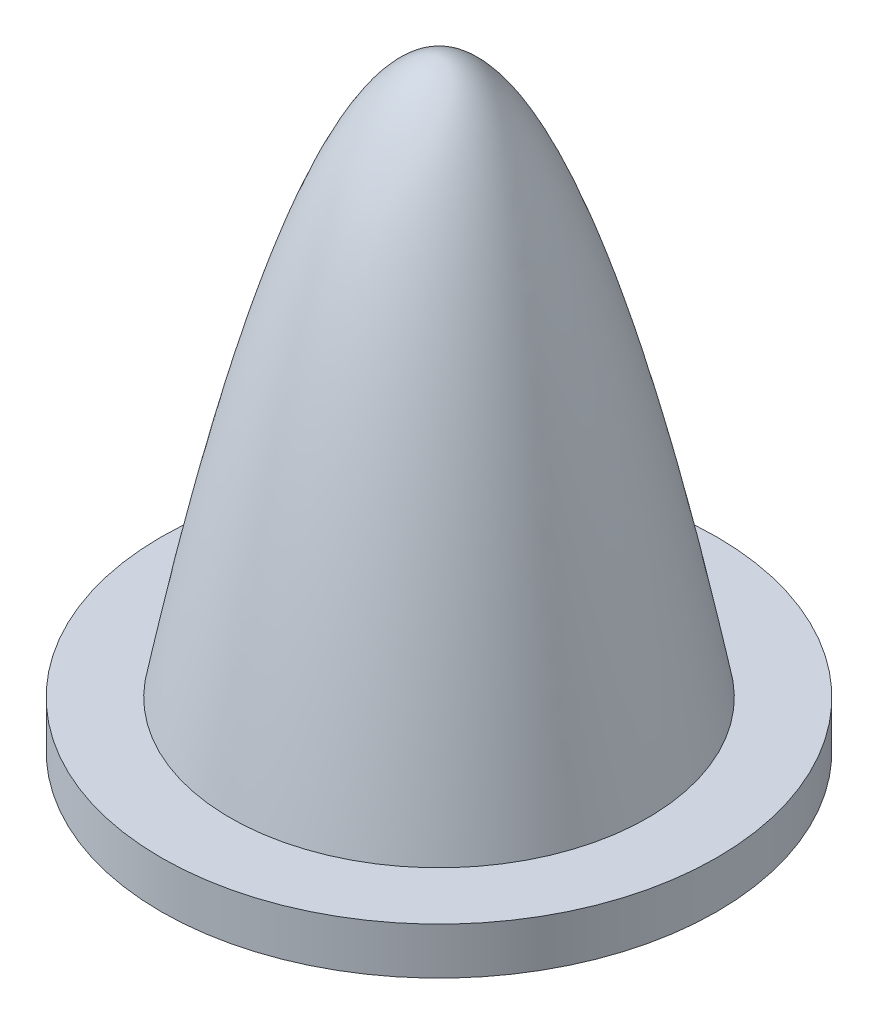
ISO-10303-21;
HEADER;
FILE_DESCRIPTION(('STEP AP214'),'2;1');
FILE_NAME('part.step','',(''),(''),'','','');
FILE_SCHEMA(('AUTOMOTIVE_DESIGN { 1 0 10303 214 1 1 1 1 }'));
ENDSEC;
DATA;
#1=APPLICATION_CONTEXT('core data for automotive mechanical design processes');
#2=APPLICATION_PROTOCOL_DEFINITION('international standard','automotive_design',2000,#1);
#3=PRODUCT_CONTEXT('',#1,'mechanical');
#4=PRODUCT('Part','Part','',(#3));
#5=PRODUCT_RELATED_PRODUCT_CATEGORY('part','',(#4));
#6=PRODUCT_DEFINITION_FORMATION('','',#4);
#7=PRODUCT_DEFINITION_CONTEXT('part definition',#1,'design');
#8=PRODUCT_DEFINITION('design','',#6,#7);
#9=PRODUCT_DEFINITION_SHAPE('','',#8);
#10=(LENGTH_UNIT() NAMED_UNIT(*) SI_UNIT(.MILLI.,.METRE.));
#11=(NAMED_UNIT(*) PLANE_ANGLE_UNIT() SI_UNIT($,.RADIAN.));
#12=(NAMED_UNIT(*) SI_UNIT($,.STERADIAN.) SOLID_ANGLE_UNIT());
#13=UNCERTAINTY_MEASURE_WITH_UNIT(LENGTH_MEASURE(1.E-05),#10,'distance_accuracy_value','');
#14=(GEOMETRIC_REPRESENTATION_CONTEXT(3) GLOBAL_UNCERTAINTY_ASSIGNED_CONTEXT((#13)) GLOBAL_UNIT_ASSIGNED_CONTEXT((#10,
#11,#12)) REPRESENTATION_CONTEXT('',''));
#15=CARTESIAN_POINT('',(0.,0.,0.));
#16=DIRECTION('',(0.,0.,1.));
#17=DIRECTION('',(1.,0.,0.));
#18=AXIS2_PLACEMENT_3D('',#15,#16,#17);
#19=CARTESIAN_POINT('',(0.,0.,0.));
#20=DIRECTION('',(0.,1.,0.));
#21=DIRECTION('',(0.,0.,1.));
#22=AXIS2_PLACEMENT_3D('',#19,#20,#21);
#23=PLANE('',#22);
#24=CARTESIAN_POINT('',(0.,0.,0.));
#25=DIRECTION('',(0.,-1.,0.));
#26=DIRECTION('',(0.,0.,-1.));
#27=AXIS2_PLACEMENT_3D('',#24,#25,#26);
#28=CIRCLE('',#27,1.89864999999999);
#29=CARTESIAN_POINT('',(0.,0.,-1.89864999999999));
#30=VERTEX_POINT('',#29);
#31=EDGE_CURVE('E63',#30,#30,#28,.T.);
#32=ORIENTED_EDGE('',*,*,#31,.F.);
#33=EDGE_LOOP('',(#32));
#34=FACE_BOUND('',#33,.T.);
#35=CARTESIAN_POINT('',(0.,0.,0.));
#36=DIRECTION('',(0.,-1.,0.));
#37=DIRECTION('',(0.,0.,-1.));
#38=AXIS2_PLACEMENT_3D('',#35,#36,#37);
#39=CIRCLE('',#38,5.94);
#40=CARTESIAN_POINT('',(0.,0.,-5.94));
#41=VERTEX_POINT('',#40);
#42=EDGE_CURVE('E11',#41,#41,#39,.T.);
#43=ORIENTED_EDGE('',*,*,#42,.T.);
#44=EDGE_LOOP('',(#43));
#45=FACE_BOUND('',#44,.T.);
#46=ADVANCED_FACE('F39',(#34,#45),#23,.F.);
#47=CARTESIAN_POINT('',(0.,0.,0.));
#48=DIRECTION('',(0.,-1.,0.));
#49=DIRECTION('',(0.,0.,-1.));
#50=AXIS2_PLACEMENT_3D('',#47,#48,#49);
#51=CYLINDRICAL_SURFACE('',#50,5.94);
#52=ORIENTED_EDGE('',*,*,#42,.F.);
#53=EDGE_LOOP('',(#52));
#54=FACE_BOUND('',#53,.T.);
#55=CARTESIAN_POINT('',(0.,0.999999999999999,0.));
#56=DIRECTION('',(0.,-1.,0.));
#57=DIRECTION('',(0.,0.,-1.));
#58=AXIS2_PLACEMENT_3D('',#55,#56,#57);
#59=CIRCLE('',#58,5.94);
#60=CARTESIAN_POINT('',(0.,0.999999999999999,-5.94));
#61=VERTEX_POINT('',#60);
#62=EDGE_CURVE('E46',#61,#61,#59,.T.);
#63=ORIENTED_EDGE('',*,*,#62,.T.);
#64=EDGE_LOOP('',(#63));
#65=FACE_BOUND('',#64,.T.);
#66=ADVANCED_FACE('F83',(#54,#65),#51,.T.);
#67=CARTESIAN_POINT('',(-5.94,0.999999999999999,0.));
#68=DIRECTION('',(0.,-1.,0.));
#69=DIRECTION('',(0.,0.,-1.));
#70=AXIS2_PLACEMENT_3D('',#67,#68,#69);
#71=PLANE('',#70);
#72=ORIENTED_EDGE('',*,*,#62,.F.);
#73=EDGE_LOOP('',(#72));
#74=FACE_BOUND('',#73,.T.);
#75=CARTESIAN_POINT('',(0.,0.999999999999999,0.));
#76=DIRECTION('',(0.,-1.,0.));
#77=DIRECTION('',(0.,0.,-1.));
#78=AXIS2_PLACEMENT_3D('',#75,#76,#77);
#79=CIRCLE('',#78,4.465);
#80=CARTESIAN_POINT('',(0.,0.999999999999999,-4.465));
#81=VERTEX_POINT('',#80);
#82=EDGE_CURVE('E62',#81,#81,#79,.T.);
#83=ORIENTED_EDGE('',*,*,#82,.T.);
#84=EDGE_LOOP('',(#83));
#85=FACE_BOUND('',#84,.T.);
#86=ADVANCED_FACE('F79',(#74,#85),#71,.F.);
#87=CARTESIAN_POINT('',(0.,12.87,0.));
#88=CARTESIAN_POINT('',(-2.24417697664194,12.7838346993345,0.));
#89=CARTESIAN_POINT('',(-4.465,0.999999999999999,0.));
#90=B_SPLINE_CURVE_WITH_KNOTS('',2,(#87,#88,#89),.UNSPECIFIED.,.F.,.F.,(3,3),(0.,1.),.UNSPECIFIED.);
#91=CARTESIAN_POINT('',(0.,0.,0.));
#92=DIRECTION('',(0.,-1.,0.));
#93=AXIS1_PLACEMENT('',#91,#92);
#94=SURFACE_OF_REVOLUTION('',#90,#93);
#95=ORIENTED_EDGE('',*,*,#82,.F.);
#96=EDGE_LOOP('',(#95));
#97=FACE_BOUND('',#96,.T.);
#98=CARTESIAN_POINT('',(0.,12.87,0.));
#99=VERTEX_POINT('',#98);
#100=VERTEX_LOOP('',#99);
#101=FACE_BOUND('',#100,.T.);
#102=ADVANCED_FACE('F56',(#97,#101),#94,.T.);
#103=CARTESIAN_POINT('',(0.,8.5,0.));
#104=DIRECTION('',(0.,-1.,0.));
#105=DIRECTION('',(0.,0.,-1.));
#106=AXIS2_PLACEMENT_3D('',#103,#104,#105);
#107=CONICAL_SURFACE('',#106,1.89865,1.02974425867665);
#108=CARTESIAN_POINT('',(0.,9.64082401431668,0.));
#109=VERTEX_POINT('',#108);
#110=VERTEX_LOOP('',#109);
#111=FACE_BOUND('',#110,.T.);
#112=CARTESIAN_POINT('',(0.,8.5,0.));
#113=DIRECTION('',(0.,-1.,0.));
#114=DIRECTION('',(0.,0.,-1.));
#115=AXIS2_PLACEMENT_3D('',#112,#113,#114);
#116=CIRCLE('',#115,1.89865);
#117=CARTESIAN_POINT('',(0.,8.5,-1.89865));
#118=VERTEX_POINT('',#117);
#119=EDGE_CURVE('E60',#118,#118,#116,.T.);
#120=ORIENTED_EDGE('',*,*,#119,.T.);
#121=EDGE_LOOP('',(#120));
#122=FACE_BOUND('',#121,.T.);
#123=ADVANCED_FACE('F52',(#111,#122),#107,.F.);
#124=CARTESIAN_POINT('',(0.,0.,0.));
#125=DIRECTION('',(0.,-1.,0.));
#126=DIRECTION('',(0.,0.,-1.));
#127=AXIS2_PLACEMENT_3D('',#124,#125,#126);
#128=CYLINDRICAL_SURFACE('',#127,1.89864999999999);
#129=ORIENTED_EDGE('',*,*,#119,.F.);
#130=EDGE_LOOP('',(#129));
#131=FACE_BOUND('',#130,.T.);
#132=ORIENTED_EDGE('',*,*,#31,.T.);
#133=EDGE_LOOP('',(#132));
#134=FACE_BOUND('',#133,.T.);
#135=ADVANCED_FACE('F55',(#131,#134),#128,.F.);
#136=CLOSED_SHELL('',(#46,#66,#86,#102,#123,#135));
#137=MANIFOLD_SOLID_BREP('B2',#136);
#138=ADVANCED_BREP_SHAPE_REPRESENTATION('',(#18,#137),#14);
#139=SHAPE_DEFINITION_REPRESENTATION(#9,#138);
ENDSEC;
END-ISO-10303-21;
